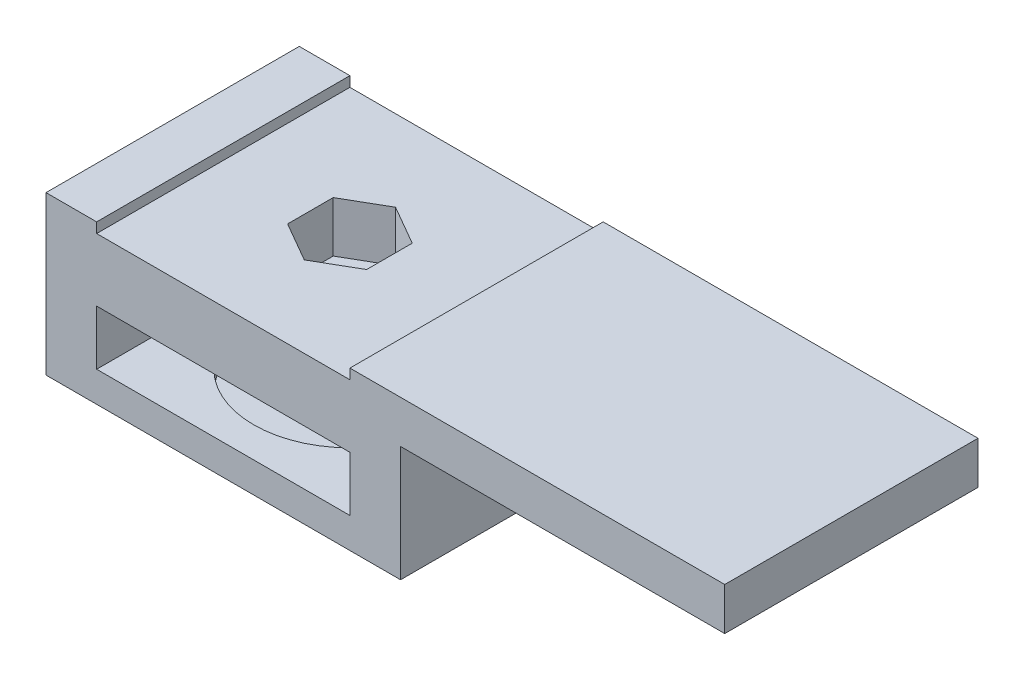
ISO-10303-21;
HEADER;
FILE_DESCRIPTION(('STEP AP214'),'2;1');
FILE_NAME('part.step','',(''),(''),'','','');
FILE_SCHEMA(('AUTOMOTIVE_DESIGN { 1 0 10303 214 1 1 1 1 }'));
ENDSEC;
DATA;
#1=APPLICATION_CONTEXT('core data for automotive mechanical design processes');
#2=APPLICATION_PROTOCOL_DEFINITION('international standard','automotive_design',2000,#1);
#3=PRODUCT_CONTEXT('',#1,'mechanical');
#4=PRODUCT('Part','Part','',(#3));
#5=PRODUCT_RELATED_PRODUCT_CATEGORY('part','',(#4));
#6=PRODUCT_DEFINITION_FORMATION('','',#4);
#7=PRODUCT_DEFINITION_CONTEXT('part definition',#1,'design');
#8=PRODUCT_DEFINITION('design','',#6,#7);
#9=PRODUCT_DEFINITION_SHAPE('','',#8);
#10=(LENGTH_UNIT() NAMED_UNIT(*) SI_UNIT(.MILLI.,.METRE.));
#11=(NAMED_UNIT(*) PLANE_ANGLE_UNIT() SI_UNIT($,.RADIAN.));
#12=(NAMED_UNIT(*) SI_UNIT($,.STERADIAN.) SOLID_ANGLE_UNIT());
#13=UNCERTAINTY_MEASURE_WITH_UNIT(LENGTH_MEASURE(1.E-05),#10,'distance_accuracy_value','');
#14=(GEOMETRIC_REPRESENTATION_CONTEXT(3) GLOBAL_UNCERTAINTY_ASSIGNED_CONTEXT((#13)) GLOBAL_UNIT_ASSIGNED_CONTEXT((#10,
#11,#12)) REPRESENTATION_CONTEXT('',''));
#15=CARTESIAN_POINT('',(0.,0.,0.));
#16=DIRECTION('',(0.,0.,1.));
#17=DIRECTION('',(1.,0.,0.));
#18=AXIS2_PLACEMENT_3D('',#15,#16,#17);
#19=CARTESIAN_POINT('',(-17.5,5.2,0.));
#20=DIRECTION('',(1.,0.,0.));
#21=DIRECTION('',(0.,0.,-1.));
#22=AXIS2_PLACEMENT_3D('',#19,#20,#21);
#23=CYLINDRICAL_SURFACE('',#22,3.1);
#24=CARTESIAN_POINT('',(17.5,5.2,0.));
#25=DIRECTION('',(1.,0.,0.));
#26=DIRECTION('',(0.,0.,-1.));
#27=AXIS2_PLACEMENT_3D('',#24,#25,#26);
#28=CIRCLE('',#27,3.1);
#29=CARTESIAN_POINT('',(17.5,5.2,-3.1));
#30=VERTEX_POINT('',#29);
#31=EDGE_CURVE('E465',#30,#30,#28,.T.);
#32=ORIENTED_EDGE('',*,*,#31,.T.);
#33=EDGE_LOOP('',(#32));
#34=FACE_BOUND('',#33,.T.);
#35=CARTESIAN_POINT('',(13.5,5.2,0.));
#36=DIRECTION('',(-1.,0.,0.));
#37=DIRECTION('',(0.,0.,1.));
#38=AXIS2_PLACEMENT_3D('',#35,#36,#37);
#39=CIRCLE('',#38,3.1);
#40=CARTESIAN_POINT('',(13.5,5.2,3.1));
#41=VERTEX_POINT('',#40);
#42=EDGE_CURVE('E11',#41,#41,#39,.F.);
#43=ORIENTED_EDGE('',*,*,#42,.F.);
#44=EDGE_LOOP('',(#43));
#45=FACE_BOUND('',#44,.T.);
#46=ADVANCED_FACE('F37',(#34,#45),#23,.F.);
#47=CARTESIAN_POINT('',(17.5,14.6,-12.5));
#48=DIRECTION('',(-1.,0.,0.));
#49=DIRECTION('',(0.,0.,1.));
#50=AXIS2_PLACEMENT_3D('',#47,#48,#49);
#51=PLANE('',#50);
#52=ORIENTED_EDGE('',*,*,#31,.F.);
#53=EDGE_LOOP('',(#52));
#54=FACE_BOUND('',#53,.T.);
#55=DIRECTION('',(0.,0.,-1.));
#56=VECTOR('',#55,1.);
#57=CARTESIAN_POINT('',(17.5,10.4,-12.5));
#58=LINE('',#57,#56);
#59=CARTESIAN_POINT('',(17.5,10.4,12.5));
#60=VERTEX_POINT('',#59);
#61=CARTESIAN_POINT('',(17.5,10.4,-12.5));
#62=VERTEX_POINT('',#61);
#63=EDGE_CURVE('E45',#60,#62,#58,.T.);
#64=ORIENTED_EDGE('',*,*,#63,.F.);
#65=DIRECTION('',(0.,-1.,0.));
#66=VECTOR('',#65,1.);
#67=CARTESIAN_POINT('',(17.5,14.6,12.5));
#68=LINE('',#67,#66);
#69=CARTESIAN_POINT('',(17.5,-1.,12.5));
#70=VERTEX_POINT('',#69);
#71=EDGE_CURVE('E310',#60,#70,#68,.T.);
#72=ORIENTED_EDGE('',*,*,#71,.T.);
#73=DIRECTION('',(0.,0.,-1.));
#74=VECTOR('',#73,1.);
#75=CARTESIAN_POINT('',(17.5,-1.,-12.5));
#76=LINE('',#75,#74);
#77=CARTESIAN_POINT('',(17.5,-1.,-12.5));
#78=VERTEX_POINT('',#77);
#79=EDGE_CURVE('E309',#70,#78,#76,.T.);
#80=ORIENTED_EDGE('',*,*,#79,.T.);
#81=DIRECTION('',(0.,-1.,0.));
#82=VECTOR('',#81,1.);
#83=CARTESIAN_POINT('',(17.5,14.6,-12.5));
#84=LINE('',#83,#82);
#85=EDGE_CURVE('E301',#62,#78,#84,.T.);
#86=ORIENTED_EDGE('',*,*,#85,.F.);
#87=EDGE_LOOP('',(#64,#72,#80,#86));
#88=FACE_BOUND('',#87,.T.);
#89=ADVANCED_FACE('F307',(#54,#88),#51,.F.);
#90=CARTESIAN_POINT('',(37.5287834302828,7.4,12.5));
#91=DIRECTION('',(0.,1.,0.));
#92=DIRECTION('',(0.,0.,1.));
#93=AXIS2_PLACEMENT_3D('',#90,#91,#92);
#94=PLANE('',#93);
#95=DIRECTION('',(0.,0.,-1.));
#96=VECTOR('',#95,1.);
#97=CARTESIAN_POINT('',(-12.5,7.4,12.5));
#98=LINE('',#97,#96);
#99=CARTESIAN_POINT('',(-12.5,7.4,12.5));
#100=VERTEX_POINT('',#99);
#101=CARTESIAN_POINT('',(-12.5,7.4,2.18403296678415));
#102=VERTEX_POINT('',#101);
#103=EDGE_CURVE('E233',#100,#102,#98,.T.);
#104=ORIENTED_EDGE('',*,*,#103,.T.);
#105=DIRECTION('',(1.,0.,0.));
#106=VECTOR('',#105,1.);
#107=CARTESIAN_POINT('',(-17.5,7.4,2.18403296678415));
#108=LINE('',#107,#106);
#109=CARTESIAN_POINT('',(-1.67107749670684,7.4,2.18403296678415));
#110=VERTEX_POINT('',#109);
#111=EDGE_CURVE('E218',#102,#110,#108,.T.);
#112=ORIENTED_EDGE('',*,*,#111,.T.);
#113=CARTESIAN_POINT('',(0.,7.4,0.));
#114=DIRECTION('',(0.,1.,0.));
#115=DIRECTION('',(0.,0.,1.));
#116=AXIS2_PLACEMENT_3D('',#113,#114,#115);
#117=CIRCLE('',#116,2.75);
#118=CARTESIAN_POINT('',(1.67107749670684,7.4,2.18403296678415));
#119=VERTEX_POINT('',#118);
#120=EDGE_CURVE('E215',#119,#110,#117,.F.);
#121=ORIENTED_EDGE('',*,*,#120,.F.);
#122=CARTESIAN_POINT('',(12.5,7.4,2.18403296678415));
#123=VERTEX_POINT('',#122);
#124=EDGE_CURVE('E198',#119,#123,#108,.T.);
#125=ORIENTED_EDGE('',*,*,#124,.T.);
#126=DIRECTION('',(0.,0.,1.));
#127=VECTOR('',#126,1.);
#128=CARTESIAN_POINT('',(12.5,7.4,12.5));
#129=LINE('',#128,#127);
#130=CARTESIAN_POINT('',(12.5,7.4,12.5));
#131=VERTEX_POINT('',#130);
#132=EDGE_CURVE('E211',#123,#131,#129,.T.);
#133=ORIENTED_EDGE('',*,*,#132,.T.);
#134=DIRECTION('',(-1.,0.,0.));
#135=VECTOR('',#134,1.);
#136=CARTESIAN_POINT('',(37.5287834302828,7.4,12.5));
#137=LINE('',#136,#135);
#138=EDGE_CURVE('E225',#131,#100,#137,.T.);
#139=ORIENTED_EDGE('',*,*,#138,.T.);
#140=EDGE_LOOP('',(#104,#112,#121,#125,#133,#139));
#141=FACE_BOUND('',#140,.T.);
#142=ADVANCED_FACE('F209',(#141),#94,.F.);
#143=CARTESIAN_POINT('',(-12.5,14.6,-12.5));
#144=DIRECTION('',(1.,0.,0.));
#145=DIRECTION('',(0.,0.,-1.));
#146=AXIS2_PLACEMENT_3D('',#143,#144,#145);
#147=PLANE('',#146);
#148=DIRECTION('',(0.,0.,1.));
#149=VECTOR('',#148,1.);
#150=CARTESIAN_POINT('',(-12.5,13.6,12.5));
#151=LINE('',#150,#149);
#152=CARTESIAN_POINT('',(-12.5,13.6,-12.5));
#153=VERTEX_POINT('',#152);
#154=CARTESIAN_POINT('',(-12.5,13.6,12.5));
#155=VERTEX_POINT('',#154);
#156=EDGE_CURVE('E349',#153,#155,#151,.T.);
#157=ORIENTED_EDGE('',*,*,#156,.F.);
#158=DIRECTION('',(0.,-1.,0.));
#159=VECTOR('',#158,1.);
#160=CARTESIAN_POINT('',(-12.5,14.6,-12.5));
#161=LINE('',#160,#159);
#162=CARTESIAN_POINT('',(-12.5,14.6,-12.5));
#163=VERTEX_POINT('',#162);
#164=EDGE_CURVE('E253',#163,#153,#161,.T.);
#165=ORIENTED_EDGE('',*,*,#164,.F.);
#166=DIRECTION('',(0.,0.,1.));
#167=VECTOR('',#166,1.);
#168=CARTESIAN_POINT('',(-12.5,14.6,-12.5));
#169=LINE('',#168,#167);
#170=CARTESIAN_POINT('',(-12.5,14.6,12.5));
#171=VERTEX_POINT('',#170);
#172=EDGE_CURVE('E238',#163,#171,#169,.T.);
#173=ORIENTED_EDGE('',*,*,#172,.T.);
#174=DIRECTION('',(0.,-1.,0.));
#175=VECTOR('',#174,1.);
#176=CARTESIAN_POINT('',(-12.5,14.6,12.5));
#177=LINE('',#176,#175);
#178=EDGE_CURVE('E264',#171,#155,#177,.T.);
#179=ORIENTED_EDGE('',*,*,#178,.T.);
#180=EDGE_LOOP('',(#157,#165,#173,#179));
#181=FACE_BOUND('',#180,.T.);
#182=ADVANCED_FACE('F504',(#181),#147,.T.);
#183=CARTESIAN_POINT('',(-12.5,5.2,0.));
#184=DIRECTION('',(1.,0.,0.));
#185=DIRECTION('',(0.,0.,-1.));
#186=AXIS2_PLACEMENT_3D('',#183,#184,#185);
#187=CIRCLE('',#186,3.1);
#188=CARTESIAN_POINT('',(-12.5,7.4,-2.18403296678415));
#189=VERTEX_POINT('',#188);
#190=EDGE_CURVE('E408',#102,#189,#187,.T.);
#191=ORIENTED_EDGE('',*,*,#190,.F.);
#192=ORIENTED_EDGE('',*,*,#103,.F.);
#193=CARTESIAN_POINT('',(-12.5,2.,12.5));
#194=VERTEX_POINT('',#193);
#195=EDGE_CURVE('E250',#100,#194,#177,.T.);
#196=ORIENTED_EDGE('',*,*,#195,.T.);
#197=DIRECTION('',(0.,0.,1.));
#198=VECTOR('',#197,1.);
#199=CARTESIAN_POINT('',(-12.5,2.,12.5));
#200=LINE('',#199,#198);
#201=CARTESIAN_POINT('',(-12.5,2.,-12.5));
#202=VERTEX_POINT('',#201);
#203=EDGE_CURVE('E282',#202,#194,#200,.T.);
#204=ORIENTED_EDGE('',*,*,#203,.F.);
#205=CARTESIAN_POINT('',(-12.5,7.4,-12.5));
#206=VERTEX_POINT('',#205);
#207=EDGE_CURVE('E257',#206,#202,#161,.T.);
#208=ORIENTED_EDGE('',*,*,#207,.F.);
#209=EDGE_CURVE('E235',#189,#206,#98,.T.);
#210=ORIENTED_EDGE('',*,*,#209,.F.);
#211=EDGE_LOOP('',(#191,#192,#196,#204,#208,#210));
#212=FACE_BOUND('',#211,.T.);
#213=ADVANCED_FACE('F394',(#212),#147,.T.);
#214=CARTESIAN_POINT('',(0.,2.,0.));
#215=DIRECTION('',(0.,-1.,0.));
#216=DIRECTION('',(0.,0.,-1.));
#217=AXIS2_PLACEMENT_3D('',#214,#215,#216);
#218=PLANE('',#217);
#219=DIRECTION('',(0.,0.,-1.));
#220=VECTOR('',#219,1.);
#221=CARTESIAN_POINT('',(12.5,2.,12.5));
#222=LINE('',#221,#220);
#223=CARTESIAN_POINT('',(12.5,2.,12.5));
#224=VERTEX_POINT('',#223);
#225=CARTESIAN_POINT('',(12.5,2.,-12.5));
#226=VERTEX_POINT('',#225);
#227=EDGE_CURVE('E274',#224,#226,#222,.T.);
#228=ORIENTED_EDGE('',*,*,#227,.T.);
#229=DIRECTION('',(-1.,0.,0.));
#230=VECTOR('',#229,1.);
#231=CARTESIAN_POINT('',(-12.5,2.,-12.5));
#232=LINE('',#231,#230);
#233=EDGE_CURVE('E279',#226,#202,#232,.T.);
#234=ORIENTED_EDGE('',*,*,#233,.T.);
#235=ORIENTED_EDGE('',*,*,#203,.T.);
#236=DIRECTION('',(1.,0.,0.));
#237=VECTOR('',#236,1.);
#238=CARTESIAN_POINT('',(-12.5,2.,12.5));
#239=LINE('',#238,#237);
#240=EDGE_CURVE('E285',#194,#224,#239,.T.);
#241=ORIENTED_EDGE('',*,*,#240,.T.);
#242=EDGE_LOOP('',(#228,#234,#235,#241));
#243=FACE_BOUND('',#242,.T.);
#244=CARTESIAN_POINT('',(0.,2.,0.));
#245=DIRECTION('',(0.,1.,0.));
#246=DIRECTION('',(0.,0.,1.));
#247=AXIS2_PLACEMENT_3D('',#244,#245,#246);
#248=CIRCLE('',#247,9.5);
#249=CARTESIAN_POINT('',(0.,2.,9.5));
#250=VERTEX_POINT('',#249);
#251=EDGE_CURVE('E271',#250,#250,#248,.T.);
#252=ORIENTED_EDGE('',*,*,#251,.F.);
#253=EDGE_LOOP('',(#252));
#254=FACE_BOUND('',#253,.T.);
#255=ADVANCED_FACE('F417',(#243,#254),#218,.F.);
#256=CARTESIAN_POINT('',(-12.5,2.,-12.5));
#257=DIRECTION('',(0.,0.,1.));
#258=DIRECTION('',(1.,0.,0.));
#259=AXIS2_PLACEMENT_3D('',#256,#257,#258);
#260=PLANE('',#259);
#261=DIRECTION('',(-1.,0.,0.));
#262=VECTOR('',#261,1.);
#263=CARTESIAN_POINT('',(12.5,14.6,-12.5));
#264=LINE('',#263,#262);
#265=CARTESIAN_POINT('',(49.5,14.6,-12.5));
#266=VERTEX_POINT('',#265);
#267=CARTESIAN_POINT('',(12.5,14.6,-12.5));
#268=VERTEX_POINT('',#267);
#269=EDGE_CURVE('E398',#266,#268,#264,.T.);
#270=ORIENTED_EDGE('',*,*,#269,.F.);
#271=DIRECTION('',(0.,1.,0.));
#272=VECTOR('',#271,1.);
#273=CARTESIAN_POINT('',(49.5,14.6,-12.5));
#274=LINE('',#273,#272);
#275=CARTESIAN_POINT('',(49.5,10.4,-12.5));
#276=VERTEX_POINT('',#275);
#277=EDGE_CURVE('E303',#276,#266,#274,.T.);
#278=ORIENTED_EDGE('',*,*,#277,.F.);
#279=DIRECTION('',(-1.,0.,0.));
#280=VECTOR('',#279,1.);
#281=CARTESIAN_POINT('',(49.5,10.4,-12.5));
#282=LINE('',#281,#280);
#283=EDGE_CURVE('E292',#276,#62,#282,.T.);
#284=ORIENTED_EDGE('',*,*,#283,.T.);
#285=ORIENTED_EDGE('',*,*,#85,.T.);
#286=DIRECTION('',(1.,0.,0.));
#287=VECTOR('',#286,1.);
#288=CARTESIAN_POINT('',(12.5,-1.,-12.5));
#289=LINE('',#288,#287);
#290=CARTESIAN_POINT('',(-17.5,-1.,-12.5));
#291=VERTEX_POINT('',#290);
#292=EDGE_CURVE('E267',#291,#78,#289,.T.);
#293=ORIENTED_EDGE('',*,*,#292,.F.);
#294=DIRECTION('',(0.,-1.,0.));
#295=VECTOR('',#294,1.);
#296=CARTESIAN_POINT('',(-17.5,14.6,-12.5));
#297=LINE('',#296,#295);
#298=CARTESIAN_POINT('',(-17.5,14.6,-12.5));
#299=VERTEX_POINT('',#298);
#300=EDGE_CURVE('E258',#299,#291,#297,.T.);
#301=ORIENTED_EDGE('',*,*,#300,.F.);
#302=DIRECTION('',(1.,0.,0.));
#303=VECTOR('',#302,1.);
#304=CARTESIAN_POINT('',(-12.5,14.6,-12.5));
#305=LINE('',#304,#303);
#306=EDGE_CURVE('E247',#299,#163,#305,.T.);
#307=ORIENTED_EDGE('',*,*,#306,.T.);
#308=ORIENTED_EDGE('',*,*,#164,.T.);
#309=DIRECTION('',(-1.,0.,0.));
#310=VECTOR('',#309,1.);
#311=CARTESIAN_POINT('',(37.5287834302828,13.6,-12.5));
#312=LINE('',#311,#310);
#313=CARTESIAN_POINT('',(12.5,13.6,-12.5));
#314=VERTEX_POINT('',#313);
#315=EDGE_CURVE('E358',#314,#153,#312,.T.);
#316=ORIENTED_EDGE('',*,*,#315,.F.);
#317=DIRECTION('',(0.,-1.,0.));
#318=VECTOR('',#317,1.);
#319=CARTESIAN_POINT('',(12.5,14.6,-12.5));
#320=LINE('',#319,#318);
#321=EDGE_CURVE('E311',#268,#314,#320,.T.);
#322=ORIENTED_EDGE('',*,*,#321,.F.);
#323=EDGE_LOOP('',(#270,#278,#284,#285,#293,#301,#307,#308,#316,#322));
#324=FACE_BOUND('',#323,.T.);
#325=DIRECTION('',(-1.,0.,0.));
#326=VECTOR('',#325,1.);
#327=CARTESIAN_POINT('',(37.5287834302828,7.4,-12.5));
#328=LINE('',#327,#326);
#329=CARTESIAN_POINT('',(12.5,7.4,-12.5));
#330=VERTEX_POINT('',#329);
#331=EDGE_CURVE('E228',#330,#206,#328,.T.);
#332=ORIENTED_EDGE('',*,*,#331,.T.);
#333=ORIENTED_EDGE('',*,*,#207,.T.);
#334=ORIENTED_EDGE('',*,*,#233,.F.);
#335=EDGE_CURVE('E314',#330,#226,#320,.T.);
#336=ORIENTED_EDGE('',*,*,#335,.F.);
#337=EDGE_LOOP('',(#332,#333,#334,#336));
#338=FACE_BOUND('',#337,.T.);
#339=ADVANCED_FACE('F39',(#324,#338),#260,.F.);
#340=CARTESIAN_POINT('',(-12.5,2.,12.5));
#341=DIRECTION('',(0.,0.,-1.));
#342=DIRECTION('',(-1.,0.,0.));
#343=AXIS2_PLACEMENT_3D('',#340,#341,#342);
#344=PLANE('',#343);
#345=ORIENTED_EDGE('',*,*,#71,.F.);
#346=DIRECTION('',(-1.,0.,0.));
#347=VECTOR('',#346,1.);
#348=CARTESIAN_POINT('',(49.5,10.4,12.5));
#349=LINE('',#348,#347);
#350=CARTESIAN_POINT('',(49.5,10.4,12.5));
#351=VERTEX_POINT('',#350);
#352=EDGE_CURVE('E295',#351,#60,#349,.T.);
#353=ORIENTED_EDGE('',*,*,#352,.F.);
#354=DIRECTION('',(0.,-1.,0.));
#355=VECTOR('',#354,1.);
#356=CARTESIAN_POINT('',(49.5,14.6,12.5));
#357=LINE('',#356,#355);
#358=CARTESIAN_POINT('',(49.5,14.6,12.5));
#359=VERTEX_POINT('',#358);
#360=EDGE_CURVE('E528',#359,#351,#357,.T.);
#361=ORIENTED_EDGE('',*,*,#360,.F.);
#362=DIRECTION('',(1.,0.,0.));
#363=VECTOR('',#362,1.);
#364=CARTESIAN_POINT('',(12.5,14.6,12.5));
#365=LINE('',#364,#363);
#366=CARTESIAN_POINT('',(12.5,14.6,12.5));
#367=VERTEX_POINT('',#366);
#368=EDGE_CURVE('E397',#367,#359,#365,.T.);
#369=ORIENTED_EDGE('',*,*,#368,.F.);
#370=DIRECTION('',(0.,-1.,0.));
#371=VECTOR('',#370,1.);
#372=CARTESIAN_POINT('',(12.5,14.6,12.5));
#373=LINE('',#372,#371);
#374=CARTESIAN_POINT('',(12.5,13.6,12.5));
#375=VERTEX_POINT('',#374);
#376=EDGE_CURVE('E321',#367,#375,#373,.T.);
#377=ORIENTED_EDGE('',*,*,#376,.T.);
#378=DIRECTION('',(1.,0.,0.));
#379=VECTOR('',#378,1.);
#380=CARTESIAN_POINT('',(37.5287834302828,13.6,12.5));
#381=LINE('',#380,#379);
#382=EDGE_CURVE('E352',#155,#375,#381,.T.);
#383=ORIENTED_EDGE('',*,*,#382,.F.);
#384=ORIENTED_EDGE('',*,*,#178,.F.);
#385=DIRECTION('',(-1.,0.,0.));
#386=VECTOR('',#385,1.);
#387=CARTESIAN_POINT('',(-12.5,14.6,12.5));
#388=LINE('',#387,#386);
#389=CARTESIAN_POINT('',(-17.5,14.6,12.5));
#390=VERTEX_POINT('',#389);
#391=EDGE_CURVE('E241',#171,#390,#388,.T.);
#392=ORIENTED_EDGE('',*,*,#391,.T.);
#393=DIRECTION('',(0.,-1.,0.));
#394=VECTOR('',#393,1.);
#395=CARTESIAN_POINT('',(-17.5,14.6,12.5));
#396=LINE('',#395,#394);
#397=CARTESIAN_POINT('',(-17.5,-1.,12.5));
#398=VERTEX_POINT('',#397);
#399=EDGE_CURVE('E261',#390,#398,#396,.T.);
#400=ORIENTED_EDGE('',*,*,#399,.T.);
#401=DIRECTION('',(-1.,0.,0.));
#402=VECTOR('',#401,1.);
#403=CARTESIAN_POINT('',(-12.5,-1.,12.5));
#404=LINE('',#403,#402);
#405=EDGE_CURVE('E256',#70,#398,#404,.T.);
#406=ORIENTED_EDGE('',*,*,#405,.F.);
#407=EDGE_LOOP('',(#345,#353,#361,#369,#377,#383,#384,#392,#400,#406));
#408=FACE_BOUND('',#407,.T.);
#409=ORIENTED_EDGE('',*,*,#138,.F.);
#410=EDGE_CURVE('E222',#131,#224,#373,.T.);
#411=ORIENTED_EDGE('',*,*,#410,.T.);
#412=ORIENTED_EDGE('',*,*,#240,.F.);
#413=ORIENTED_EDGE('',*,*,#195,.F.);
#414=EDGE_LOOP('',(#409,#411,#412,#413));
#415=FACE_BOUND('',#414,.T.);
#416=ADVANCED_FACE('F415',(#408,#415),#344,.F.);
#417=CARTESIAN_POINT('',(0.,2.,0.));
#418=DIRECTION('',(0.,-1.,0.));
#419=DIRECTION('',(0.,0.,-1.));
#420=AXIS2_PLACEMENT_3D('',#417,#418,#419);
#421=CYLINDRICAL_SURFACE('',#420,9.5);
#422=ORIENTED_EDGE('',*,*,#251,.T.);
#423=EDGE_LOOP('',(#422));
#424=FACE_BOUND('',#423,.T.);
#425=CARTESIAN_POINT('',(0.,0.,0.));
#426=DIRECTION('',(0.,1.,0.));
#427=DIRECTION('',(0.,0.,1.));
#428=AXIS2_PLACEMENT_3D('',#425,#426,#427);
#429=CIRCLE('',#428,9.5);
#430=CARTESIAN_POINT('',(0.,0.,9.5));
#431=VERTEX_POINT('',#430);
#432=EDGE_CURVE('E270',#431,#431,#429,.T.);
#433=ORIENTED_EDGE('',*,*,#432,.F.);
#434=EDGE_LOOP('',(#433));
#435=FACE_BOUND('',#434,.T.);
#436=ADVANCED_FACE('F423',(#424,#435),#421,.F.);
#437=CARTESIAN_POINT('',(0.,0.,0.));
#438=DIRECTION('',(0.,1.,0.));
#439=DIRECTION('',(0.,0.,1.));
#440=AXIS2_PLACEMENT_3D('',#437,#438,#439);
#441=PLANE('',#440);
#442=ORIENTED_EDGE('',*,*,#432,.T.);
#443=EDGE_LOOP('',(#442));
#444=FACE_BOUND('',#443,.T.);
#445=ADVANCED_FACE('F426',(#444),#441,.T.);
#446=CARTESIAN_POINT('',(0.,-1.,0.));
#447=DIRECTION('',(0.,1.,0.));
#448=DIRECTION('',(0.,0.,1.));
#449=AXIS2_PLACEMENT_3D('',#446,#447,#448);
#450=PLANE('',#449);
#451=ORIENTED_EDGE('',*,*,#405,.T.);
#452=DIRECTION('',(0.,0.,-1.));
#453=VECTOR('',#452,1.);
#454=CARTESIAN_POINT('',(-17.5,-1.,-12.5));
#455=LINE('',#454,#453);
#456=EDGE_CURVE('E227',#398,#291,#455,.T.);
#457=ORIENTED_EDGE('',*,*,#456,.T.);
#458=ORIENTED_EDGE('',*,*,#292,.T.);
#459=ORIENTED_EDGE('',*,*,#79,.F.);
#460=EDGE_LOOP('',(#451,#457,#458,#459));
#461=FACE_BOUND('',#460,.T.);
#462=ADVANCED_FACE('F431',(#461),#450,.F.);
#463=CARTESIAN_POINT('',(-17.5,14.6,-12.5));
#464=DIRECTION('',(-1.,0.,0.));
#465=DIRECTION('',(0.,0.,1.));
#466=AXIS2_PLACEMENT_3D('',#463,#464,#465);
#467=PLANE('',#466);
#468=CARTESIAN_POINT('',(-17.5,5.2,0.));
#469=DIRECTION('',(1.,0.,0.));
#470=DIRECTION('',(0.,0.,-1.));
#471=AXIS2_PLACEMENT_3D('',#468,#469,#470);
#472=CIRCLE('',#471,3.1);
#473=CARTESIAN_POINT('',(-17.5,5.2,-3.1));
#474=VERTEX_POINT('',#473);
#475=EDGE_CURVE('E463',#474,#474,#472,.T.);
#476=ORIENTED_EDGE('',*,*,#475,.T.);
#477=EDGE_LOOP('',(#476));
#478=FACE_BOUND('',#477,.T.);
#479=ORIENTED_EDGE('',*,*,#456,.F.);
#480=ORIENTED_EDGE('',*,*,#399,.F.);
#481=DIRECTION('',(0.,0.,-1.));
#482=VECTOR('',#481,1.);
#483=CARTESIAN_POINT('',(-17.5,14.6,-12.5));
#484=LINE('',#483,#482);
#485=EDGE_CURVE('E244',#390,#299,#484,.T.);
#486=ORIENTED_EDGE('',*,*,#485,.T.);
#487=ORIENTED_EDGE('',*,*,#300,.T.);
#488=EDGE_LOOP('',(#479,#480,#486,#487));
#489=FACE_BOUND('',#488,.T.);
#490=ADVANCED_FACE('F436',(#478,#489),#467,.T.);
#491=CARTESIAN_POINT('',(0.,14.6,0.));
#492=DIRECTION('',(0.,-1.,0.));
#493=DIRECTION('',(0.,0.,-1.));
#494=AXIS2_PLACEMENT_3D('',#491,#492,#493);
#495=PLANE('',#494);
#496=ORIENTED_EDGE('',*,*,#172,.F.);
#497=ORIENTED_EDGE('',*,*,#306,.F.);
#498=ORIENTED_EDGE('',*,*,#485,.F.);
#499=ORIENTED_EDGE('',*,*,#391,.F.);
#500=EDGE_LOOP('',(#496,#497,#498,#499));
#501=FACE_BOUND('',#500,.T.);
#502=ADVANCED_FACE('F495',(#501),#495,.F.);
#503=CARTESIAN_POINT('',(37.5287834302828,8.6,12.5));
#504=DIRECTION('',(0.,-1.,0.));
#505=DIRECTION('',(0.,0.,-1.));
#506=AXIS2_PLACEMENT_3D('',#503,#504,#505);
#507=PLANE('',#506);
#508=DIRECTION('',(0.866025403784439,0.,-0.5));
#509=VECTOR('',#508,1.);
#510=CARTESIAN_POINT('',(24.6839287990594,8.6,-9.74794083711535));
#511=LINE('',#510,#509);
#512=CARTESIAN_POINT('',(1.04083408558608E-13,8.6,4.5033320996791));
#513=VERTEX_POINT('',#512);
#514=CARTESIAN_POINT('',(3.90000000000003,8.6,2.2516660498396));
#515=VERTEX_POINT('',#514);
#516=EDGE_CURVE('E361',#513,#515,#511,.T.);
#517=ORIENTED_EDGE('',*,*,#516,.T.);
#518=DIRECTION('',(0.,0.,-1.));
#519=VECTOR('',#518,1.);
#520=CARTESIAN_POINT('',(3.90000000000004,8.6,12.5));
#521=LINE('',#520,#519);
#522=CARTESIAN_POINT('',(3.90000000000001,8.6,-2.25166604983956));
#523=VERTEX_POINT('',#522);
#524=EDGE_CURVE('E376',#515,#523,#521,.T.);
#525=ORIENTED_EDGE('',*,*,#524,.T.);
#526=DIRECTION('',(-0.866025403784442,0.,-0.499999999999994));
#527=VECTOR('',#526,1.);
#528=CARTESIAN_POINT('',(35.509246346365,8.6,15.9979408371152));
#529=LINE('',#528,#527);
#530=CARTESIAN_POINT('',(0.,8.6,-4.50333209967907));
#531=VERTEX_POINT('',#530);
#532=EDGE_CURVE('E373',#523,#531,#529,.T.);
#533=ORIENTED_EDGE('',*,*,#532,.T.);
#534=DIRECTION('',(-0.866025403784439,0.,0.5));
#535=VECTOR('',#534,1.);
#536=CARTESIAN_POINT('',(20.7839287990594,8.6,-16.502938986634));
#537=LINE('',#536,#535);
#538=CARTESIAN_POINT('',(-3.89999999999995,8.6,-2.25166604983956));
#539=VERTEX_POINT('',#538);
#540=EDGE_CURVE('E370',#531,#539,#537,.T.);
#541=ORIENTED_EDGE('',*,*,#540,.T.);
#542=DIRECTION('',(0.,0.,1.));
#543=VECTOR('',#542,1.);
#544=CARTESIAN_POINT('',(-3.89999999999995,8.6,12.5));
#545=LINE('',#544,#543);
#546=CARTESIAN_POINT('',(-3.89999999999996,8.6,2.25166604983952));
#547=VERTEX_POINT('',#546);
#548=EDGE_CURVE('E367',#539,#547,#545,.T.);
#549=ORIENTED_EDGE('',*,*,#548,.T.);
#550=DIRECTION('',(0.866025403784439,0.,0.499999999999999));
#551=VECTOR('',#550,1.);
#552=CARTESIAN_POINT('',(31.6092463463649,8.6,22.752938986634));
#553=LINE('',#552,#551);
#554=EDGE_CURVE('E364',#547,#513,#553,.T.);
#555=ORIENTED_EDGE('',*,*,#554,.T.);
#556=EDGE_LOOP('',(#517,#525,#533,#541,#549,#555));
#557=FACE_BOUND('',#556,.T.);
#558=CARTESIAN_POINT('',(0.,8.6,0.));
#559=DIRECTION('',(0.,1.,0.));
#560=DIRECTION('',(0.,0.,1.));
#561=AXIS2_PLACEMENT_3D('',#558,#559,#560);
#562=CIRCLE('',#561,2.75);
#563=CARTESIAN_POINT('',(0.,8.6,2.75));
#564=VERTEX_POINT('',#563);
#565=EDGE_CURVE('E378',#564,#564,#562,.T.);
#566=ORIENTED_EDGE('',*,*,#565,.F.);
#567=EDGE_LOOP('',(#566));
#568=FACE_BOUND('',#567,.T.);
#569=ADVANCED_FACE('F491',(#557,#568),#507,.F.);
#570=CARTESIAN_POINT('',(12.5,7.4,-2.18403296678415));
#571=VERTEX_POINT('',#570);
#572=EDGE_CURVE('E224',#330,#571,#129,.T.);
#573=ORIENTED_EDGE('',*,*,#572,.T.);
#574=DIRECTION('',(1.,0.,0.));
#575=VECTOR('',#574,1.);
#576=CARTESIAN_POINT('',(-17.5,7.4,-2.18403296678415));
#577=LINE('',#576,#575);
#578=CARTESIAN_POINT('',(1.67107749670684,7.4,-2.18403296678415));
#579=VERTEX_POINT('',#578);
#580=EDGE_CURVE('E201',#571,#579,#577,.F.);
#581=ORIENTED_EDGE('',*,*,#580,.T.);
#582=CARTESIAN_POINT('',(-1.67107749670684,7.4,-2.18403296678415));
#583=VERTEX_POINT('',#582);
#584=EDGE_CURVE('E382',#583,#579,#117,.F.);
#585=ORIENTED_EDGE('',*,*,#584,.F.);
#586=EDGE_CURVE('E52',#583,#189,#577,.F.);
#587=ORIENTED_EDGE('',*,*,#586,.T.);
#588=ORIENTED_EDGE('',*,*,#209,.T.);
#589=ORIENTED_EDGE('',*,*,#331,.F.);
#590=EDGE_LOOP('',(#573,#581,#585,#587,#588,#589));
#591=FACE_BOUND('',#590,.T.);
#592=ADVANCED_FACE('F390',(#591),#94,.F.);
#593=CARTESIAN_POINT('',(0.,-0.378174593052023,0.));
#594=DIRECTION('',(0.,1.,0.));
#595=DIRECTION('',(0.,0.,1.));
#596=AXIS2_PLACEMENT_3D('',#593,#594,#595);
#597=CYLINDRICAL_SURFACE('',#596,2.75);
#598=ORIENTED_EDGE('',*,*,#120,.T.);
#599=CARTESIAN_POINT('',(-1.67107749670684,7.4,2.18403296678415));
#600=CARTESIAN_POINT('',(-1.73149312441483,7.44591778976555,2.13778676734864));
#601=CARTESIAN_POINT('',(-1.7901819741856,7.4915218420306,2.08892463447644));
#602=CARTESIAN_POINT('',(-1.90392417902882,7.58142371462101,1.98582441608004));
#603=CARTESIAN_POINT('',(-1.95897185678667,7.62571943813626,1.93157825038926));
#604=CARTESIAN_POINT('',(-2.06553792480947,7.71256762347208,1.81719772692295));
#605=CARTESIAN_POINT('',(-2.11702038702629,7.75510097339765,1.75701508975021));
#606=CARTESIAN_POINT('',(-2.21540611265548,7.83719325724976,1.63121167712638));
#607=CARTESIAN_POINT('',(-2.26231223031057,7.87675404156495,1.56559433910752));
#608=CARTESIAN_POINT('',(-2.37536162990278,7.97281949060709,1.39142678205157));
#609=CARTESIAN_POINT('',(-2.43795726197531,8.02672624898996,1.27905766576522));
#610=CARTESIAN_POINT('',(-2.54803381513938,8.12219599827784,1.0425567529605));
#611=CARTESIAN_POINT('',(-2.59556114678389,8.16379686443766,0.918462633036684));
#612=CARTESIAN_POINT('',(-2.65367086617825,8.21486079241614,0.724684836957536));
#613=CARTESIAN_POINT('',(-2.67090298351027,8.23004540979836,0.658424161111803));
#614=CARTESIAN_POINT('',(-2.70048773757787,8.25615523423849,0.524014729637825));
#615=CARTESIAN_POINT('',(-2.71284288139948,8.2670826297515,0.455866963431172));
#616=CARTESIAN_POINT('',(-2.73240571860508,8.28439949440431,0.318256861200151));
#617=CARTESIAN_POINT('',(-2.73961308881445,8.29078867863738,0.248794442923551));
#618=CARTESIAN_POINT('',(-2.74871867403605,8.29886280903751,0.109276022483438));
#619=CARTESIAN_POINT('',(-2.75061769377142,8.30054846823871,0.039220111906082));
#620=CARTESIAN_POINT('',(-2.74847529069868,8.29864655866744,-0.150624892595905));
#621=CARTESIAN_POINT('',(-2.73925349291164,8.29046049493954,-0.270378439395512));
#622=CARTESIAN_POINT('',(-2.7056863544025,8.26074832446227,-0.505914062631063));
#623=CARTESIAN_POINT('',(-2.68134325459592,8.23922419436127,-0.621696724853631));
#624=CARTESIAN_POINT('',(-2.61931271663319,8.18464115328381,-0.845629812529263));
#625=CARTESIAN_POINT('',(-2.58173713273983,8.15167896145848,-0.953835367851268));
#626=CARTESIAN_POINT('',(-2.49502908968976,8.07614698708087,-1.1619256720757));
#627=CARTESIAN_POINT('',(-2.44588627839625,8.03356859986626,-1.26180285840231));
#628=CARTESIAN_POINT('',(-2.31281927172065,7.9193671044314,-1.49632541650582));
#629=CARTESIAN_POINT('',(-2.22331143981742,7.84340968035821,-1.62573650168597));
#630=CARTESIAN_POINT('',(-2.07686909749143,7.72193478097175,-1.80417865878015));
#631=CARTESIAN_POINT('',(-2.02598862904737,7.68015770406687,-1.86107816720643));
#632=CARTESIAN_POINT('',(-1.9204768467283,7.59473611621453,-1.96977164076316));
#633=CARTESIAN_POINT('',(-1.86584661261505,7.55109214420052,-2.02156706526067));
#634=CARTESIAN_POINT('',(-1.76443107368314,7.47155386747934,-2.11017778809436));
#635=CARTESIAN_POINT('',(-1.71828042813583,7.43586817534979,-2.14790969201908));
#636=CARTESIAN_POINT('',(-1.6710774967069,7.4,-2.18403296678422));
#637=B_SPLINE_CURVE_WITH_KNOTS('',3,(#599,#600,#601,#602,#603,#604,#605,#606,#607,#608,#609,
#610,#611,#612,#613,#614,#615,#616,#617,#618,#619,#620,#621,#622,#623,#624,#625,#626,#627,#628,
#629,#630,#631,#632,#633,#634,#635,#636),.UNSPECIFIED.,.F.,.F.,(4,2,2,2,2,2,2,2,2,2,2,2,2,2,2,2,
2,2,4),(0.,0.266579872307027,0.533566048078393,0.802937696563566,1.07214025067344,
1.48889526325162,1.90435390642807,2.11446438236823,2.32446670656206,2.5344822134366,
2.74446588113483,3.10366836694368,3.46281763309945,3.81900113215054,4.17550461927041,
4.69658248818119,4.95745357202275,5.21824984948138,5.42654536416695),.UNSPECIFIED.);
#638=EDGE_CURVE('E477',#110,#583,#637,.T.);
#639=ORIENTED_EDGE('',*,*,#638,.T.);
#640=ORIENTED_EDGE('',*,*,#584,.T.);
#641=CARTESIAN_POINT('',(1.67107749670684,7.4,-2.18403296678415));
#642=CARTESIAN_POINT('',(1.73149312441483,7.44591778976555,-2.13778676734864));
#643=CARTESIAN_POINT('',(1.7901819741856,7.4915218420306,-2.08892463447644));
#644=CARTESIAN_POINT('',(1.90392417902882,7.58142371462101,-1.98582441608004));
#645=CARTESIAN_POINT('',(1.95897185678667,7.62571943813626,-1.93157825038926));
#646=CARTESIAN_POINT('',(2.06553792480947,7.71256762347208,-1.81719772692295));
#647=CARTESIAN_POINT('',(2.11702038702629,7.75510097339765,-1.75701508975021));
#648=CARTESIAN_POINT('',(2.21540611265548,7.83719325724976,-1.63121167712638));
#649=CARTESIAN_POINT('',(2.26231223031057,7.87675404156495,-1.56559433910752));
#650=CARTESIAN_POINT('',(2.37536162990278,7.97281949060709,-1.39142678205157));
#651=CARTESIAN_POINT('',(2.43795726197531,8.02672624898996,-1.27905766576522));
#652=CARTESIAN_POINT('',(2.54803381513938,8.12219599827784,-1.0425567529605));
#653=CARTESIAN_POINT('',(2.59556114678389,8.16379686443766,-0.918462633036684));
#654=CARTESIAN_POINT('',(2.65367086617825,8.21486079241614,-0.724684836957536));
#655=CARTESIAN_POINT('',(2.67090298351027,8.23004540979836,-0.658424161111803));
#656=CARTESIAN_POINT('',(2.70048773757787,8.25615523423849,-0.524014729637825));
#657=CARTESIAN_POINT('',(2.71284288139948,8.2670826297515,-0.455866963431172));
#658=CARTESIAN_POINT('',(2.73240571860508,8.28439949440431,-0.318256861200151));
#659=CARTESIAN_POINT('',(2.73961308881445,8.29078867863738,-0.248794442923551));
#660=CARTESIAN_POINT('',(2.74871867403605,8.29886280903751,-0.109276022483438));
#661=CARTESIAN_POINT('',(2.75061769377142,8.30054846823871,-0.039220111906082));
#662=CARTESIAN_POINT('',(2.74847529069868,8.29864655866744,0.150624892595905));
#663=CARTESIAN_POINT('',(2.73925349291164,8.29046049493954,0.270378439395512));
#664=CARTESIAN_POINT('',(2.7056863544025,8.26074832446227,0.505914062631063));
#665=CARTESIAN_POINT('',(2.68134325459592,8.23922419436127,0.621696724853631));
#666=CARTESIAN_POINT('',(2.61931271663319,8.18464115328381,0.845629812529263));
#667=CARTESIAN_POINT('',(2.58173713273983,8.15167896145848,0.953835367851268));
#668=CARTESIAN_POINT('',(2.49502908968976,8.07614698708087,1.1619256720757));
#669=CARTESIAN_POINT('',(2.44588627839625,8.03356859986626,1.26180285840231));
#670=CARTESIAN_POINT('',(2.31281927172065,7.9193671044314,1.49632541650582));
#671=CARTESIAN_POINT('',(2.22331143981742,7.84340968035821,1.62573650168597));
#672=CARTESIAN_POINT('',(2.07686909749143,7.72193478097175,1.80417865878015));
#673=CARTESIAN_POINT('',(2.02598862904737,7.68015770406687,1.86107816720643));
#674=CARTESIAN_POINT('',(1.9204768467283,7.59473611621453,1.96977164076316));
#675=CARTESIAN_POINT('',(1.86584661261505,7.55109214420052,2.02156706526067));
#676=CARTESIAN_POINT('',(1.76443107368314,7.47155386747934,2.11017778809436));
#677=CARTESIAN_POINT('',(1.71828042813583,7.43586817534979,2.14790969201908));
#678=CARTESIAN_POINT('',(1.6710774967069,7.4,2.18403296678422));
#679=B_SPLINE_CURVE_WITH_KNOTS('',3,(#641,#642,#643,#644,#645,#646,#647,#648,#649,#650,#651,
#652,#653,#654,#655,#656,#657,#658,#659,#660,#661,#662,#663,#664,#665,#666,#667,#668,#669,#670,
#671,#672,#673,#674,#675,#676,#677,#678),.UNSPECIFIED.,.F.,.F.,(4,2,2,2,2,2,2,2,2,2,2,2,2,2,2,2,
2,2,4),(0.,0.266579872307027,0.533566048078393,0.802937696563566,1.07214025067344,
1.48889526325162,1.90435390642807,2.11446438236823,2.32446670656206,2.5344822134366,
2.74446588113483,3.10366836694368,3.46281763309945,3.81900113215054,4.17550461927041,
4.69658248818119,4.95745357202275,5.21824984948138,5.42654536416695),.UNSPECIFIED.);
#680=EDGE_CURVE('E216',#579,#119,#679,.T.);
#681=ORIENTED_EDGE('',*,*,#680,.T.);
#682=EDGE_LOOP('',(#598,#639,#640,#681));
#683=FACE_BOUND('',#682,.T.);
#684=ORIENTED_EDGE('',*,*,#565,.T.);
#685=EDGE_LOOP('',(#684));
#686=FACE_BOUND('',#685,.T.);
#687=ADVANCED_FACE('F483',(#683,#686),#597,.F.);
#688=CARTESIAN_POINT('',(3.90000000000004,13.6,12.5));
#689=DIRECTION('',(-1.,0.,0.));
#690=DIRECTION('',(0.,0.,1.));
#691=AXIS2_PLACEMENT_3D('',#688,#689,#690);
#692=PLANE('',#691);
#693=ORIENTED_EDGE('',*,*,#524,.F.);
#694=DIRECTION('',(0.,-1.,0.));
#695=VECTOR('',#694,1.);
#696=CARTESIAN_POINT('',(3.90000000000002,13.6,2.25166604983961));
#697=LINE('',#696,#695);
#698=CARTESIAN_POINT('',(3.90000000000002,13.6,2.25166604983961));
#699=VERTEX_POINT('',#698);
#700=EDGE_CURVE('E332',#699,#515,#697,.T.);
#701=ORIENTED_EDGE('',*,*,#700,.F.);
#702=DIRECTION('',(0.,0.,-1.));
#703=VECTOR('',#702,1.);
#704=CARTESIAN_POINT('',(3.90000000000004,13.6,12.5));
#705=LINE('',#704,#703);
#706=CARTESIAN_POINT('',(3.90000000000001,13.6,-2.25166604983956));
#707=VERTEX_POINT('',#706);
#708=EDGE_CURVE('E318',#699,#707,#705,.T.);
#709=ORIENTED_EDGE('',*,*,#708,.T.);
#710=DIRECTION('',(0.,-1.,0.));
#711=VECTOR('',#710,1.);
#712=CARTESIAN_POINT('',(3.90000000000001,13.6,-2.25166604983956));
#713=LINE('',#712,#711);
#714=EDGE_CURVE('E346',#707,#523,#713,.T.);
#715=ORIENTED_EDGE('',*,*,#714,.T.);
#716=EDGE_LOOP('',(#693,#701,#709,#715));
#717=FACE_BOUND('',#716,.T.);
#718=ADVANCED_FACE('F488',(#717),#692,.T.);
#719=CARTESIAN_POINT('',(35.509246346365,13.6,15.9979408371152));
#720=DIRECTION('',(-0.499999999999994,0.,0.866025403784442));
#721=DIRECTION('',(0.866025403784442,0.,0.499999999999994));
#722=AXIS2_PLACEMENT_3D('',#719,#720,#721);
#723=PLANE('',#722);
#724=ORIENTED_EDGE('',*,*,#532,.F.);
#725=ORIENTED_EDGE('',*,*,#714,.F.);
#726=DIRECTION('',(-0.866025403784442,0.,-0.499999999999994));
#727=VECTOR('',#726,1.);
#728=CARTESIAN_POINT('',(35.509246346365,13.6,15.9979408371152));
#729=LINE('',#728,#727);
#730=CARTESIAN_POINT('',(0.,13.6,-4.50333209967907));
#731=VERTEX_POINT('',#730);
#732=EDGE_CURVE('E320',#707,#731,#729,.T.);
#733=ORIENTED_EDGE('',*,*,#732,.T.);
#734=DIRECTION('',(0.,-1.,0.));
#735=VECTOR('',#734,1.);
#736=CARTESIAN_POINT('',(0.,13.6,-4.50333209967907));
#737=LINE('',#736,#735);
#738=EDGE_CURVE('E343',#731,#531,#737,.T.);
#739=ORIENTED_EDGE('',*,*,#738,.T.);
#740=EDGE_LOOP('',(#724,#725,#733,#739));
#741=FACE_BOUND('',#740,.T.);
#742=ADVANCED_FACE('F565',(#741),#723,.T.);
#743=CARTESIAN_POINT('',(20.7839287990594,13.6,-16.502938986634));
#744=DIRECTION('',(0.5,0.,0.866025403784438));
#745=DIRECTION('',(0.866025403784439,0.,-0.5));
#746=AXIS2_PLACEMENT_3D('',#743,#744,#745);
#747=PLANE('',#746);
#748=ORIENTED_EDGE('',*,*,#540,.F.);
#749=ORIENTED_EDGE('',*,*,#738,.F.);
#750=DIRECTION('',(-0.866025403784439,0.,0.5));
#751=VECTOR('',#750,1.);
#752=CARTESIAN_POINT('',(20.7839287990594,13.6,-16.502938986634));
#753=LINE('',#752,#751);
#754=CARTESIAN_POINT('',(-3.89999999999995,13.6,-2.25166604983956));
#755=VERTEX_POINT('',#754);
#756=EDGE_CURVE('E323',#731,#755,#753,.T.);
#757=ORIENTED_EDGE('',*,*,#756,.T.);
#758=DIRECTION('',(0.,-1.,0.));
#759=VECTOR('',#758,1.);
#760=CARTESIAN_POINT('',(-3.89999999999995,13.6,-2.25166604983956));
#761=LINE('',#760,#759);
#762=EDGE_CURVE('E340',#755,#539,#761,.T.);
#763=ORIENTED_EDGE('',*,*,#762,.T.);
#764=EDGE_LOOP('',(#748,#749,#757,#763));
#765=FACE_BOUND('',#764,.T.);
#766=ADVANCED_FACE('F561',(#765),#747,.T.);
#767=CARTESIAN_POINT('',(-3.89999999999995,13.6,12.5));
#768=DIRECTION('',(1.,0.,0.));
#769=DIRECTION('',(0.,0.,-1.));
#770=AXIS2_PLACEMENT_3D('',#767,#768,#769);
#771=PLANE('',#770);
#772=ORIENTED_EDGE('',*,*,#548,.F.);
#773=ORIENTED_EDGE('',*,*,#762,.F.);
#774=DIRECTION('',(0.,0.,1.));
#775=VECTOR('',#774,1.);
#776=CARTESIAN_POINT('',(-3.89999999999995,13.6,12.5));
#777=LINE('',#776,#775);
#778=CARTESIAN_POINT('',(-3.89999999999996,13.6,2.25166604983952));
#779=VERTEX_POINT('',#778);
#780=EDGE_CURVE('E325',#755,#779,#777,.T.);
#781=ORIENTED_EDGE('',*,*,#780,.T.);
#782=DIRECTION('',(0.,-1.,0.));
#783=VECTOR('',#782,1.);
#784=CARTESIAN_POINT('',(-3.89999999999996,13.6,2.25166604983952));
#785=LINE('',#784,#783);
#786=EDGE_CURVE('E337',#779,#547,#785,.T.);
#787=ORIENTED_EDGE('',*,*,#786,.T.);
#788=EDGE_LOOP('',(#772,#773,#781,#787));
#789=FACE_BOUND('',#788,.T.);
#790=ADVANCED_FACE('F557',(#789),#771,.T.);
#791=CARTESIAN_POINT('',(31.6092463463649,13.6,22.752938986634));
#792=DIRECTION('',(0.499999999999999,0.,-0.866025403784439));
#793=DIRECTION('',(-0.866025403784439,0.,-0.499999999999999));
#794=AXIS2_PLACEMENT_3D('',#791,#792,#793);
#795=PLANE('',#794);
#796=ORIENTED_EDGE('',*,*,#554,.F.);
#797=ORIENTED_EDGE('',*,*,#786,.F.);
#798=DIRECTION('',(0.866025403784439,0.,0.499999999999999));
#799=VECTOR('',#798,1.);
#800=CARTESIAN_POINT('',(31.6092463463649,13.6,22.752938986634));
#801=LINE('',#800,#799);
#802=CARTESIAN_POINT('',(1.04083408558608E-13,13.6,4.50333209967911));
#803=VERTEX_POINT('',#802);
#804=EDGE_CURVE('E327',#779,#803,#801,.T.);
#805=ORIENTED_EDGE('',*,*,#804,.T.);
#806=DIRECTION('',(0.,-1.,0.));
#807=VECTOR('',#806,1.);
#808=CARTESIAN_POINT('',(1.04083408558608E-13,13.6,4.5033320996791));
#809=LINE('',#808,#807);
#810=EDGE_CURVE('E334',#803,#513,#809,.T.);
#811=ORIENTED_EDGE('',*,*,#810,.T.);
#812=EDGE_LOOP('',(#796,#797,#805,#811));
#813=FACE_BOUND('',#812,.T.);
#814=ADVANCED_FACE('F553',(#813),#795,.T.);
#815=CARTESIAN_POINT('',(24.6839287990594,13.6,-9.74794083711534));
#816=DIRECTION('',(-0.5,0.,-0.866025403784438));
#817=DIRECTION('',(-0.866025403784439,0.,0.5));
#818=AXIS2_PLACEMENT_3D('',#815,#816,#817);
#819=PLANE('',#818);
#820=ORIENTED_EDGE('',*,*,#516,.F.);
#821=ORIENTED_EDGE('',*,*,#810,.F.);
#822=DIRECTION('',(0.866025403784439,0.,-0.5));
#823=VECTOR('',#822,1.);
#824=CARTESIAN_POINT('',(24.6839287990594,13.6,-9.74794083711534));
#825=LINE('',#824,#823);
#826=EDGE_CURVE('E330',#803,#699,#825,.T.);
#827=ORIENTED_EDGE('',*,*,#826,.T.);
#828=ORIENTED_EDGE('',*,*,#700,.T.);
#829=EDGE_LOOP('',(#820,#821,#827,#828));
#830=FACE_BOUND('',#829,.T.);
#831=ADVANCED_FACE('F549',(#830),#819,.T.);
#832=CARTESIAN_POINT('',(0.,13.6,0.));
#833=DIRECTION('',(0.,1.,0.));
#834=DIRECTION('',(0.,0.,1.));
#835=AXIS2_PLACEMENT_3D('',#832,#833,#834);
#836=PLANE('',#835);
#837=ORIENTED_EDGE('',*,*,#156,.T.);
#838=ORIENTED_EDGE('',*,*,#382,.T.);
#839=DIRECTION('',(0.,0.,-1.));
#840=VECTOR('',#839,1.);
#841=CARTESIAN_POINT('',(12.5,13.6,12.5));
#842=LINE('',#841,#840);
#843=EDGE_CURVE('E355',#375,#314,#842,.T.);
#844=ORIENTED_EDGE('',*,*,#843,.T.);
#845=ORIENTED_EDGE('',*,*,#315,.T.);
#846=EDGE_LOOP('',(#837,#838,#844,#845));
#847=FACE_BOUND('',#846,.T.);
#848=ORIENTED_EDGE('',*,*,#732,.F.);
#849=ORIENTED_EDGE('',*,*,#708,.F.);
#850=ORIENTED_EDGE('',*,*,#826,.F.);
#851=ORIENTED_EDGE('',*,*,#804,.F.);
#852=ORIENTED_EDGE('',*,*,#780,.F.);
#853=ORIENTED_EDGE('',*,*,#756,.F.);
#854=EDGE_LOOP('',(#848,#849,#850,#851,#852,#853));
#855=FACE_BOUND('',#854,.T.);
#856=ADVANCED_FACE('F489',(#847,#855),#836,.T.);
#857=CARTESIAN_POINT('',(12.5,14.6,-12.5));
#858=DIRECTION('',(1.,0.,0.));
#859=DIRECTION('',(0.,0.,-1.));
#860=AXIS2_PLACEMENT_3D('',#857,#858,#859);
#861=PLANE('',#860);
#862=ORIENTED_EDGE('',*,*,#132,.F.);
#863=CARTESIAN_POINT('',(12.5,5.2,0.));
#864=DIRECTION('',(-1.,0.,0.));
#865=DIRECTION('',(0.,0.,1.));
#866=AXIS2_PLACEMENT_3D('',#863,#864,#865);
#867=CIRCLE('',#866,3.1);
#868=EDGE_CURVE('E60',#571,#123,#867,.F.);
#869=ORIENTED_EDGE('',*,*,#868,.F.);
#870=ORIENTED_EDGE('',*,*,#572,.F.);
#871=ORIENTED_EDGE('',*,*,#335,.T.);
#872=ORIENTED_EDGE('',*,*,#227,.F.);
#873=ORIENTED_EDGE('',*,*,#410,.F.);
#874=EDGE_LOOP('',(#862,#869,#870,#871,#872,#873));
#875=FACE_BOUND('',#874,.T.);
#876=CARTESIAN_POINT('',(12.5,5.2,0.));
#877=DIRECTION('',(-1.,0.,0.));
#878=DIRECTION('',(0.,0.,1.));
#879=AXIS2_PLACEMENT_3D('',#876,#877,#878);
#880=CIRCLE('',#879,1.);
#881=CARTESIAN_POINT('',(12.5,5.2,1.));
#882=VERTEX_POINT('',#881);
#883=EDGE_CURVE('E204',#882,#882,#880,.T.);
#884=ORIENTED_EDGE('',*,*,#883,.F.);
#885=EDGE_LOOP('',(#884));
#886=FACE_BOUND('',#885,.T.);
#887=ADVANCED_FACE('F219',(#875,#886),#861,.F.);
#888=ORIENTED_EDGE('',*,*,#843,.F.);
#889=ORIENTED_EDGE('',*,*,#376,.F.);
#890=DIRECTION('',(0.,0.,1.));
#891=VECTOR('',#890,1.);
#892=CARTESIAN_POINT('',(12.5,14.6,-12.5));
#893=LINE('',#892,#891);
#894=EDGE_CURVE('E404',#268,#367,#893,.T.);
#895=ORIENTED_EDGE('',*,*,#894,.F.);
#896=ORIENTED_EDGE('',*,*,#321,.T.);
#897=EDGE_LOOP('',(#888,#889,#895,#896));
#898=FACE_BOUND('',#897,.T.);
#899=ADVANCED_FACE('F518',(#898),#861,.F.);
#900=CARTESIAN_POINT('',(0.,14.6,0.));
#901=DIRECTION('',(0.,-1.,0.));
#902=DIRECTION('',(0.,0.,-1.));
#903=AXIS2_PLACEMENT_3D('',#900,#901,#902);
#904=PLANE('',#903);
#905=ORIENTED_EDGE('',*,*,#894,.T.);
#906=ORIENTED_EDGE('',*,*,#368,.T.);
#907=DIRECTION('',(0.,0.,1.));
#908=VECTOR('',#907,1.);
#909=CARTESIAN_POINT('',(49.5,14.6,12.5));
#910=LINE('',#909,#908);
#911=EDGE_CURVE('E304',#266,#359,#910,.T.);
#912=ORIENTED_EDGE('',*,*,#911,.F.);
#913=ORIENTED_EDGE('',*,*,#269,.T.);
#914=EDGE_LOOP('',(#905,#906,#912,#913));
#915=FACE_BOUND('',#914,.T.);
#916=ADVANCED_FACE('F454',(#915),#904,.F.);
#917=ORIENTED_EDGE('',*,*,#580,.F.);
#918=ORIENTED_EDGE('',*,*,#868,.T.);
#919=ORIENTED_EDGE('',*,*,#124,.F.);
#920=ORIENTED_EDGE('',*,*,#680,.F.);
#921=EDGE_LOOP('',(#917,#918,#919,#920));
#922=FACE_BOUND('',#921,.T.);
#923=ADVANCED_FACE('F197',(#922),#23,.F.);
#924=ORIENTED_EDGE('',*,*,#190,.T.);
#925=ORIENTED_EDGE('',*,*,#586,.F.);
#926=ORIENTED_EDGE('',*,*,#638,.F.);
#927=ORIENTED_EDGE('',*,*,#111,.F.);
#928=EDGE_LOOP('',(#924,#925,#926,#927));
#929=FACE_BOUND('',#928,.T.);
#930=ORIENTED_EDGE('',*,*,#475,.F.);
#931=EDGE_LOOP('',(#930));
#932=FACE_BOUND('',#931,.T.);
#933=ADVANCED_FACE('F442',(#929,#932),#23,.F.);
#934=CARTESIAN_POINT('',(49.5,10.4,12.5));
#935=DIRECTION('',(0.,1.,0.));
#936=DIRECTION('',(0.,0.,1.));
#937=AXIS2_PLACEMENT_3D('',#934,#935,#936);
#938=PLANE('',#937);
#939=ORIENTED_EDGE('',*,*,#352,.T.);
#940=ORIENTED_EDGE('',*,*,#63,.T.);
#941=ORIENTED_EDGE('',*,*,#283,.F.);
#942=DIRECTION('',(0.,0.,-1.));
#943=VECTOR('',#942,1.);
#944=CARTESIAN_POINT('',(49.5,10.4,12.5));
#945=LINE('',#944,#943);
#946=EDGE_CURVE('E523',#351,#276,#945,.T.);
#947=ORIENTED_EDGE('',*,*,#946,.F.);
#948=EDGE_LOOP('',(#939,#940,#941,#947));
#949=FACE_BOUND('',#948,.T.);
#950=ADVANCED_FACE('F291',(#949),#938,.F.);
#951=CARTESIAN_POINT('',(49.5,0.,0.));
#952=DIRECTION('',(1.,0.,0.));
#953=DIRECTION('',(0.,0.,-1.));
#954=AXIS2_PLACEMENT_3D('',#951,#952,#953);
#955=PLANE('',#954);
#956=ORIENTED_EDGE('',*,*,#360,.T.);
#957=ORIENTED_EDGE('',*,*,#946,.T.);
#958=ORIENTED_EDGE('',*,*,#277,.T.);
#959=ORIENTED_EDGE('',*,*,#911,.T.);
#960=EDGE_LOOP('',(#956,#957,#958,#959));
#961=FACE_BOUND('',#960,.T.);
#962=ADVANCED_FACE('F459',(#961),#955,.T.);
#963=CARTESIAN_POINT('',(13.5,5.2,0.));
#964=DIRECTION('',(-1.,0.,0.));
#965=DIRECTION('',(0.,0.,1.));
#966=AXIS2_PLACEMENT_3D('',#963,#964,#965);
#967=CYLINDRICAL_SURFACE('',#966,1.);
#968=CARTESIAN_POINT('',(13.5,5.2,0.));
#969=DIRECTION('',(-1.,0.,0.));
#970=DIRECTION('',(0.,0.,1.));
#971=AXIS2_PLACEMENT_3D('',#968,#969,#970);
#972=CIRCLE('',#971,1.);
#973=CARTESIAN_POINT('',(13.5,5.2,1.));
#974=VERTEX_POINT('',#973);
#975=EDGE_CURVE('E203',#974,#974,#972,.T.);
#976=ORIENTED_EDGE('',*,*,#975,.F.);
#977=EDGE_LOOP('',(#976));
#978=FACE_BOUND('',#977,.T.);
#979=ORIENTED_EDGE('',*,*,#883,.T.);
#980=EDGE_LOOP('',(#979));
#981=FACE_BOUND('',#980,.T.);
#982=ADVANCED_FACE('F538',(#978,#981),#967,.F.);
#983=CARTESIAN_POINT('',(13.5,0.,0.));
#984=DIRECTION('',(-1.,0.,0.));
#985=DIRECTION('',(0.,0.,1.));
#986=AXIS2_PLACEMENT_3D('',#983,#984,#985);
#987=PLANE('',#986);
#988=ORIENTED_EDGE('',*,*,#975,.T.);
#989=EDGE_LOOP('',(#988));
#990=FACE_BOUND('',#989,.T.);
#991=ORIENTED_EDGE('',*,*,#42,.T.);
#992=EDGE_LOOP('',(#991));
#993=FACE_BOUND('',#992,.T.);
#994=ADVANCED_FACE('F535',(#990,#993),#987,.F.);
#995=CLOSED_SHELL('',(#46,#89,#142,#182,#213,#255,#339,#416,#436,#445,#462,#490,#502,#569,#592,
#687,#718,#742,#766,#790,#814,#831,#856,#887,#899,#916,#923,#933,#950,#962,#982,#994));
#996=MANIFOLD_SOLID_BREP('B2',#995);
#997=ADVANCED_BREP_SHAPE_REPRESENTATION('',(#18,#996),#14);
#998=SHAPE_DEFINITION_REPRESENTATION(#9,#997);
ENDSEC;
END-ISO-10303-21;
